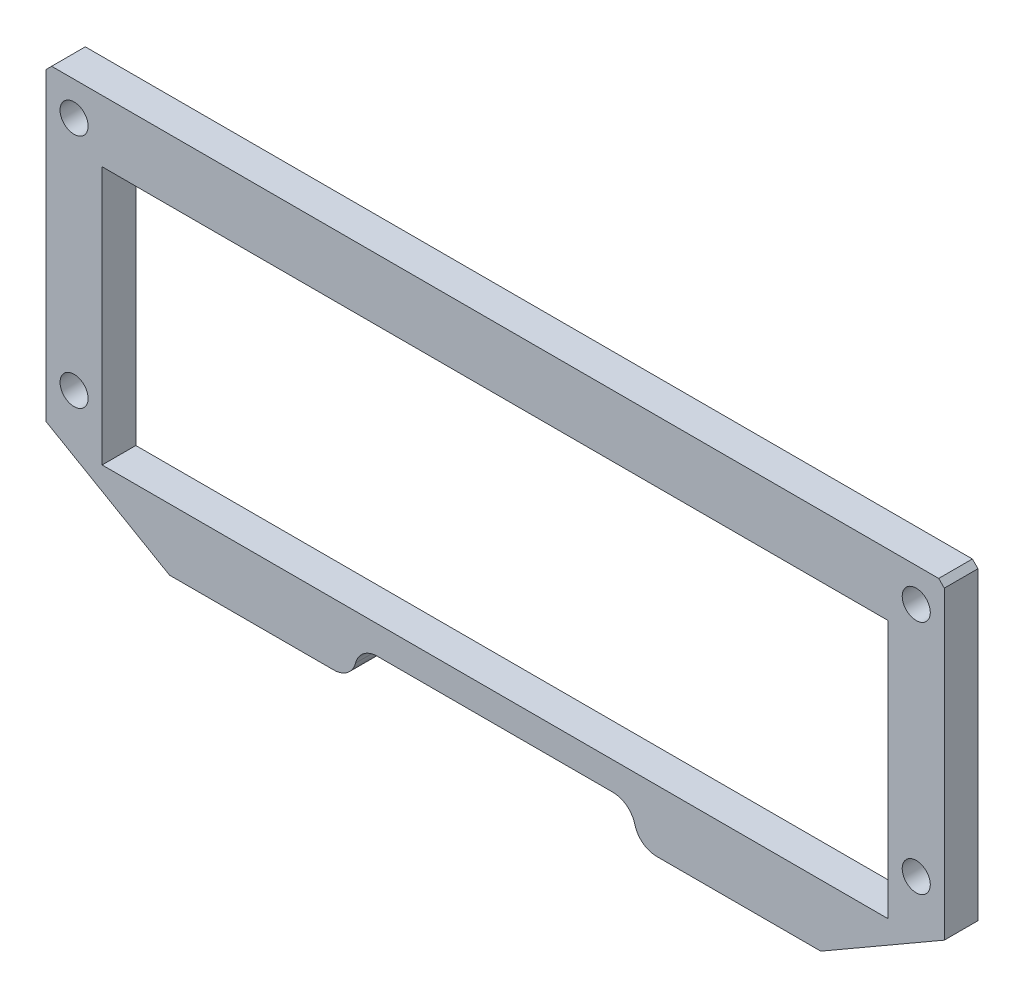
ISO-10303-21;
HEADER;
FILE_DESCRIPTION(('STEP AP214'),'2;1');
FILE_NAME('part.step','',(''),(''),'','','');
FILE_SCHEMA(('AUTOMOTIVE_DESIGN { 1 0 10303 214 1 1 1 1 }'));
ENDSEC;
DATA;
#1=APPLICATION_CONTEXT('core data for automotive mechanical design processes');
#2=APPLICATION_PROTOCOL_DEFINITION('international standard','automotive_design',2000,#1);
#3=PRODUCT_CONTEXT('',#1,'mechanical');
#4=PRODUCT('Part','Part','',(#3));
#5=PRODUCT_RELATED_PRODUCT_CATEGORY('part','',(#4));
#6=PRODUCT_DEFINITION_FORMATION('','',#4);
#7=PRODUCT_DEFINITION_CONTEXT('part definition',#1,'design');
#8=PRODUCT_DEFINITION('design','',#6,#7);
#9=PRODUCT_DEFINITION_SHAPE('','',#8);
#10=(LENGTH_UNIT() NAMED_UNIT(*) SI_UNIT(.MILLI.,.METRE.));
#11=(NAMED_UNIT(*) PLANE_ANGLE_UNIT() SI_UNIT($,.RADIAN.));
#12=(NAMED_UNIT(*) SI_UNIT($,.STERADIAN.) SOLID_ANGLE_UNIT());
#13=UNCERTAINTY_MEASURE_WITH_UNIT(LENGTH_MEASURE(1.E-05),#10,'distance_accuracy_value','');
#14=(GEOMETRIC_REPRESENTATION_CONTEXT(3) GLOBAL_UNCERTAINTY_ASSIGNED_CONTEXT((#13)) GLOBAL_UNIT_ASSIGNED_CONTEXT((#10,
#11,#12)) REPRESENTATION_CONTEXT('',''));
#15=CARTESIAN_POINT('',(0.,0.,0.));
#16=DIRECTION('',(0.,0.,1.));
#17=DIRECTION('',(1.,0.,0.));
#18=AXIS2_PLACEMENT_3D('',#15,#16,#17);
#19=CARTESIAN_POINT('',(-40.,-17.,3.));
#20=DIRECTION('',(0.,1.,0.));
#21=DIRECTION('',(0.,0.,1.));
#22=AXIS2_PLACEMENT_3D('',#19,#20,#21);
#23=PLANE('',#22);
#24=DIRECTION('',(1.,0.,0.));
#25=VECTOR('',#24,1.);
#26=CARTESIAN_POINT('',(-40.,-17.,0.));
#27=LINE('',#26,#25);
#28=CARTESIAN_POINT('',(-28.9999999999999,-17.,0.));
#29=VERTEX_POINT('',#28);
#30=CARTESIAN_POINT('',(-14.3729833462074,-17.,0.));
#31=VERTEX_POINT('',#30);
#32=EDGE_CURVE('E215',#29,#31,#27,.T.);
#33=ORIENTED_EDGE('',*,*,#32,.T.);
#34=DIRECTION('',(0.,0.,-1.));
#35=VECTOR('',#34,1.);
#36=CARTESIAN_POINT('',(-14.3729833462074,-17.,3.));
#37=LINE('',#36,#35);
#38=CARTESIAN_POINT('',(-14.3729833462074,-17.,3.));
#39=VERTEX_POINT('',#38);
#40=EDGE_CURVE('E42',#31,#39,#37,.F.);
#41=ORIENTED_EDGE('',*,*,#40,.T.);
#42=DIRECTION('',(1.,0.,0.));
#43=VECTOR('',#42,1.);
#44=CARTESIAN_POINT('',(-40.,-17.,3.));
#45=LINE('',#44,#43);
#46=CARTESIAN_POINT('',(-28.9999999999999,-17.,3.));
#47=VERTEX_POINT('',#46);
#48=EDGE_CURVE('E203',#47,#39,#45,.T.);
#49=ORIENTED_EDGE('',*,*,#48,.F.);
#50=DIRECTION('',(0.,0.,-1.));
#51=VECTOR('',#50,1.);
#52=CARTESIAN_POINT('',(-28.9999999999999,-17.,3.));
#53=LINE('',#52,#51);
#54=EDGE_CURVE('E265',#47,#29,#53,.T.);
#55=ORIENTED_EDGE('',*,*,#54,.T.);
#56=EDGE_LOOP('',(#33,#41,#49,#55));
#57=FACE_BOUND('',#56,.T.);
#58=ADVANCED_FACE('F34',(#57),#23,.F.);
#59=CARTESIAN_POINT('',(-40.,17.,3.));
#60=DIRECTION('',(1.,0.,0.));
#61=DIRECTION('',(0.,0.,-1.));
#62=AXIS2_PLACEMENT_3D('',#59,#60,#61);
#63=PLANE('',#62);
#64=DIRECTION('',(0.,-1.,0.));
#65=VECTOR('',#64,1.);
#66=CARTESIAN_POINT('',(-40.,17.,0.));
#67=LINE('',#66,#65);
#68=CARTESIAN_POINT('',(-40.,16.5,0.));
#69=VERTEX_POINT('',#68);
#70=CARTESIAN_POINT('',(-40.,-10.6491470389141,0.));
#71=VERTEX_POINT('',#70);
#72=EDGE_CURVE('E196',#69,#71,#67,.T.);
#73=ORIENTED_EDGE('',*,*,#72,.T.);
#74=DIRECTION('',(0.,0.,1.));
#75=VECTOR('',#74,1.);
#76=CARTESIAN_POINT('',(-40.,-10.6491470389141,3.));
#77=LINE('',#76,#75);
#78=CARTESIAN_POINT('',(-40.,-10.6491470389141,3.));
#79=VERTEX_POINT('',#78);
#80=EDGE_CURVE('E270',#71,#79,#77,.T.);
#81=ORIENTED_EDGE('',*,*,#80,.T.);
#82=DIRECTION('',(0.,-1.,0.));
#83=VECTOR('',#82,1.);
#84=CARTESIAN_POINT('',(-40.,17.,3.));
#85=LINE('',#84,#83);
#86=CARTESIAN_POINT('',(-40.,16.5,3.));
#87=VERTEX_POINT('',#86);
#88=EDGE_CURVE('E198',#87,#79,#85,.T.);
#89=ORIENTED_EDGE('',*,*,#88,.F.);
#90=DIRECTION('',(0.,0.,-1.));
#91=VECTOR('',#90,1.);
#92=CARTESIAN_POINT('',(-40.,16.5,3.));
#93=LINE('',#92,#91);
#94=EDGE_CURVE('E211',#87,#69,#93,.T.);
#95=ORIENTED_EDGE('',*,*,#94,.T.);
#96=EDGE_LOOP('',(#73,#81,#89,#95));
#97=FACE_BOUND('',#96,.T.);
#98=ADVANCED_FACE('F301',(#97),#63,.F.);
#99=CARTESIAN_POINT('',(14.3729833462074,-17.,3.));
#100=VERTEX_POINT('',#99);
#101=CARTESIAN_POINT('',(28.9999999999999,-17.,3.));
#102=VERTEX_POINT('',#101);
#103=EDGE_CURVE('E201',#100,#102,#45,.T.);
#104=ORIENTED_EDGE('',*,*,#103,.F.);
#105=DIRECTION('',(0.,0.,-1.));
#106=VECTOR('',#105,1.);
#107=CARTESIAN_POINT('',(14.3729833462074,-17.,3.));
#108=LINE('',#107,#106);
#109=CARTESIAN_POINT('',(14.3729833462074,-17.,0.));
#110=VERTEX_POINT('',#109);
#111=EDGE_CURVE('E281',#100,#110,#108,.T.);
#112=ORIENTED_EDGE('',*,*,#111,.T.);
#113=CARTESIAN_POINT('',(28.9999999999999,-17.,0.));
#114=VERTEX_POINT('',#113);
#115=EDGE_CURVE('E214',#110,#114,#27,.T.);
#116=ORIENTED_EDGE('',*,*,#115,.T.);
#117=DIRECTION('',(0.,0.,1.));
#118=VECTOR('',#117,1.);
#119=CARTESIAN_POINT('',(28.9999999999999,-17.,3.));
#120=LINE('',#119,#118);
#121=EDGE_CURVE('E260',#114,#102,#120,.T.);
#122=ORIENTED_EDGE('',*,*,#121,.T.);
#123=EDGE_LOOP('',(#104,#112,#116,#122));
#124=FACE_BOUND('',#123,.T.);
#125=ADVANCED_FACE('F327',(#124),#23,.F.);
#126=CARTESIAN_POINT('',(40.,17.,3.));
#127=DIRECTION('',(-1.,0.,0.));
#128=DIRECTION('',(0.,0.,1.));
#129=AXIS2_PLACEMENT_3D('',#126,#127,#128);
#130=PLANE('',#129);
#131=DIRECTION('',(0.,1.,0.));
#132=VECTOR('',#131,1.);
#133=CARTESIAN_POINT('',(40.,17.,3.));
#134=LINE('',#133,#132);
#135=CARTESIAN_POINT('',(40.,-10.6491470389141,3.));
#136=VERTEX_POINT('',#135);
#137=CARTESIAN_POINT('',(40.,16.5,3.));
#138=VERTEX_POINT('',#137);
#139=EDGE_CURVE('E206',#136,#138,#134,.T.);
#140=ORIENTED_EDGE('',*,*,#139,.F.);
#141=DIRECTION('',(0.,0.,-1.));
#142=VECTOR('',#141,1.);
#143=CARTESIAN_POINT('',(40.,-10.6491470389141,3.));
#144=LINE('',#143,#142);
#145=CARTESIAN_POINT('',(40.,-10.6491470389141,0.));
#146=VERTEX_POINT('',#145);
#147=EDGE_CURVE('E254',#136,#146,#144,.T.);
#148=ORIENTED_EDGE('',*,*,#147,.T.);
#149=DIRECTION('',(0.,1.,0.));
#150=VECTOR('',#149,1.);
#151=CARTESIAN_POINT('',(40.,17.,0.));
#152=LINE('',#151,#150);
#153=CARTESIAN_POINT('',(40.,16.5,0.));
#154=VERTEX_POINT('',#153);
#155=EDGE_CURVE('E217',#146,#154,#152,.T.);
#156=ORIENTED_EDGE('',*,*,#155,.T.);
#157=DIRECTION('',(0.,0.,1.));
#158=VECTOR('',#157,1.);
#159=CARTESIAN_POINT('',(40.,16.5,3.));
#160=LINE('',#159,#158);
#161=EDGE_CURVE('E237',#154,#138,#160,.T.);
#162=ORIENTED_EDGE('',*,*,#161,.T.);
#163=EDGE_LOOP('',(#140,#148,#156,#162));
#164=FACE_BOUND('',#163,.T.);
#165=ADVANCED_FACE('F320',(#164),#130,.F.);
#166=CARTESIAN_POINT('',(-40.,17.,3.));
#167=DIRECTION('',(0.,-1.,0.));
#168=DIRECTION('',(0.,0.,-1.));
#169=AXIS2_PLACEMENT_3D('',#166,#167,#168);
#170=PLANE('',#169);
#171=DIRECTION('',(-1.,0.,0.));
#172=VECTOR('',#171,1.);
#173=CARTESIAN_POINT('',(-40.,17.,0.));
#174=LINE('',#173,#172);
#175=CARTESIAN_POINT('',(39.5,17.,0.));
#176=VERTEX_POINT('',#175);
#177=CARTESIAN_POINT('',(-39.5,17.,0.));
#178=VERTEX_POINT('',#177);
#179=EDGE_CURVE('E202',#176,#178,#174,.T.);
#180=ORIENTED_EDGE('',*,*,#179,.T.);
#181=DIRECTION('',(0.,0.,1.));
#182=VECTOR('',#181,1.);
#183=CARTESIAN_POINT('',(-39.5,17.,3.));
#184=LINE('',#183,#182);
#185=CARTESIAN_POINT('',(-39.5,17.,3.));
#186=VERTEX_POINT('',#185);
#187=EDGE_CURVE('E231',#178,#186,#184,.T.);
#188=ORIENTED_EDGE('',*,*,#187,.T.);
#189=DIRECTION('',(-1.,0.,0.));
#190=VECTOR('',#189,1.);
#191=CARTESIAN_POINT('',(-40.,17.,3.));
#192=LINE('',#191,#190);
#193=CARTESIAN_POINT('',(39.5,17.,3.));
#194=VERTEX_POINT('',#193);
#195=EDGE_CURVE('E208',#194,#186,#192,.T.);
#196=ORIENTED_EDGE('',*,*,#195,.F.);
#197=DIRECTION('',(0.,0.,-1.));
#198=VECTOR('',#197,1.);
#199=CARTESIAN_POINT('',(39.5,17.,3.));
#200=LINE('',#199,#198);
#201=EDGE_CURVE('E228',#194,#176,#200,.T.);
#202=ORIENTED_EDGE('',*,*,#201,.T.);
#203=EDGE_LOOP('',(#180,#188,#196,#202));
#204=FACE_BOUND('',#203,.T.);
#205=ADVANCED_FACE('F309',(#204),#170,.F.);
#206=CARTESIAN_POINT('',(-40.,-17.,3.));
#207=DIRECTION('',(0.,0.,1.));
#208=DIRECTION('',(1.,0.,0.));
#209=AXIS2_PLACEMENT_3D('',#206,#207,#208);
#210=PLANE('',#209);
#211=CARTESIAN_POINT('',(-37.5,-7.,3.));
#212=DIRECTION('',(0.,0.,-1.));
#213=DIRECTION('',(-1.,0.,0.));
#214=AXIS2_PLACEMENT_3D('',#211,#212,#213);
#215=CIRCLE('',#214,1.25);
#216=CARTESIAN_POINT('',(-38.75,-7.,3.));
#217=VERTEX_POINT('',#216);
#218=EDGE_CURVE('E569',#217,#217,#215,.T.);
#219=ORIENTED_EDGE('',*,*,#218,.T.);
#220=EDGE_LOOP('',(#219));
#221=FACE_BOUND('',#220,.T.);
#222=CARTESIAN_POINT('',(-37.5,14.,3.));
#223=DIRECTION('',(0.,0.,-1.));
#224=DIRECTION('',(-1.,0.,0.));
#225=AXIS2_PLACEMENT_3D('',#222,#223,#224);
#226=CIRCLE('',#225,1.25);
#227=CARTESIAN_POINT('',(-38.75,14.,3.));
#228=VERTEX_POINT('',#227);
#229=EDGE_CURVE('E578',#228,#228,#226,.T.);
#230=ORIENTED_EDGE('',*,*,#229,.T.);
#231=EDGE_LOOP('',(#230));
#232=FACE_BOUND('',#231,.T.);
#233=CARTESIAN_POINT('',(37.5,14.,3.));
#234=DIRECTION('',(0.,0.,-1.));
#235=DIRECTION('',(-1.,0.,0.));
#236=AXIS2_PLACEMENT_3D('',#233,#234,#235);
#237=CIRCLE('',#236,1.25);
#238=CARTESIAN_POINT('',(36.25,14.,3.));
#239=VERTEX_POINT('',#238);
#240=EDGE_CURVE('E584',#239,#239,#237,.T.);
#241=ORIENTED_EDGE('',*,*,#240,.T.);
#242=EDGE_LOOP('',(#241));
#243=FACE_BOUND('',#242,.T.);
#244=CARTESIAN_POINT('',(37.5,-6.99999999999999,3.));
#245=DIRECTION('',(0.,0.,-1.));
#246=DIRECTION('',(-1.,0.,0.));
#247=AXIS2_PLACEMENT_3D('',#244,#245,#246);
#248=CIRCLE('',#247,1.25);
#249=CARTESIAN_POINT('',(36.25,-6.99999999999999,3.));
#250=VERTEX_POINT('',#249);
#251=EDGE_CURVE('E343',#250,#250,#248,.T.);
#252=ORIENTED_EDGE('',*,*,#251,.T.);
#253=EDGE_LOOP('',(#252));
#254=FACE_BOUND('',#253,.T.);
#255=CARTESIAN_POINT('',(10.5,-16.,3.));
#256=DIRECTION('',(0.,0.,1.));
#257=DIRECTION('',(1.,0.,0.));
#258=AXIS2_PLACEMENT_3D('',#255,#256,#257);
#259=CIRCLE('',#258,2.);
#260=CARTESIAN_POINT('',(10.5,-14.,3.));
#261=VERTEX_POINT('',#260);
#262=CARTESIAN_POINT('',(12.4364916731037,-15.5,3.));
#263=VERTEX_POINT('',#262);
#264=EDGE_CURVE('E245',#261,#263,#259,.F.);
#265=ORIENTED_EDGE('',*,*,#264,.T.);
#266=CARTESIAN_POINT('',(14.3729833462074,-15.,3.));
#267=DIRECTION('',(0.,0.,1.));
#268=DIRECTION('',(1.,0.,0.));
#269=AXIS2_PLACEMENT_3D('',#266,#267,#268);
#270=CIRCLE('',#269,2.);
#271=EDGE_CURVE('E279',#263,#100,#270,.T.);
#272=ORIENTED_EDGE('',*,*,#271,.T.);
#273=ORIENTED_EDGE('',*,*,#103,.T.);
#274=DIRECTION('',(-0.86602540378444,-0.499999999999998,0.));
#275=VECTOR('',#274,1.);
#276=CARTESIAN_POINT('',(-22.7500000000001,-46.877876430563,3.));
#277=LINE('',#276,#275);
#278=EDGE_CURVE('E263',#102,#136,#277,.F.);
#279=ORIENTED_EDGE('',*,*,#278,.T.);
#280=ORIENTED_EDGE('',*,*,#139,.T.);
#281=DIRECTION('',(0.707106781186552,-0.707106781186543,0.));
#282=VECTOR('',#281,1.);
#283=CARTESIAN_POINT('',(16.7499999999994,39.7500000000002,3.));
#284=LINE('',#283,#282);
#285=EDGE_CURVE('E233',#138,#194,#284,.F.);
#286=ORIENTED_EDGE('',*,*,#285,.T.);
#287=ORIENTED_EDGE('',*,*,#195,.T.);
#288=DIRECTION('',(0.707106781186557,0.707106781186538,0.));
#289=VECTOR('',#288,1.);
#290=CARTESIAN_POINT('',(-56.75,-0.249999999999535,3.));
#291=LINE('',#290,#289);
#292=EDGE_CURVE('E235',#186,#87,#291,.F.);
#293=ORIENTED_EDGE('',*,*,#292,.T.);
#294=ORIENTED_EDGE('',*,*,#88,.T.);
#295=DIRECTION('',(-0.86602540378444,0.499999999999998,0.));
#296=VECTOR('',#295,1.);
#297=CARTESIAN_POINT('',(-37.25,-12.2368602791856,3.));
#298=LINE('',#297,#296);
#299=EDGE_CURVE('E272',#79,#47,#298,.F.);
#300=ORIENTED_EDGE('',*,*,#299,.T.);
#301=ORIENTED_EDGE('',*,*,#48,.T.);
#302=CARTESIAN_POINT('',(-14.3729833462074,-15.,3.));
#303=DIRECTION('',(0.,0.,1.));
#304=DIRECTION('',(1.,0.,0.));
#305=AXIS2_PLACEMENT_3D('',#302,#303,#304);
#306=CIRCLE('',#305,2.);
#307=CARTESIAN_POINT('',(-12.4364916731037,-15.5,3.));
#308=VERTEX_POINT('',#307);
#309=EDGE_CURVE('E277',#39,#308,#306,.T.);
#310=ORIENTED_EDGE('',*,*,#309,.T.);
#311=CARTESIAN_POINT('',(-10.5,-16.,3.));
#312=DIRECTION('',(0.,0.,1.));
#313=DIRECTION('',(1.,0.,0.));
#314=AXIS2_PLACEMENT_3D('',#311,#312,#313);
#315=CIRCLE('',#314,2.);
#316=CARTESIAN_POINT('',(-10.5,-14.,3.));
#317=VERTEX_POINT('',#316);
#318=EDGE_CURVE('E250',#308,#317,#315,.F.);
#319=ORIENTED_EDGE('',*,*,#318,.T.);
#320=DIRECTION('',(-1.,0.,0.));
#321=VECTOR('',#320,1.);
#322=CARTESIAN_POINT('',(-12.5,-14.,3.));
#323=LINE('',#322,#321);
#324=EDGE_CURVE('E339',#261,#317,#323,.T.);
#325=ORIENTED_EDGE('',*,*,#324,.F.);
#326=EDGE_LOOP('',(#265,#272,#273,#279,#280,#286,#287,#293,#294,#300,#301,#310,#319,#325));
#327=FACE_BOUND('',#326,.T.);
#328=DIRECTION('',(0.,-1.,0.));
#329=VECTOR('',#328,1.);
#330=CARTESIAN_POINT('',(-35.,11.5,3.));
#331=LINE('',#330,#329);
#332=CARTESIAN_POINT('',(-35.,11.5,3.));
#333=VERTEX_POINT('',#332);
#334=CARTESIAN_POINT('',(-35.,-11.5,3.));
#335=VERTEX_POINT('',#334);
#336=EDGE_CURVE('E181',#333,#335,#331,.T.);
#337=ORIENTED_EDGE('',*,*,#336,.F.);
#338=DIRECTION('',(-1.,0.,0.));
#339=VECTOR('',#338,1.);
#340=CARTESIAN_POINT('',(-35.,11.5,3.));
#341=LINE('',#340,#339);
#342=CARTESIAN_POINT('',(35.,11.5,3.));
#343=VERTEX_POINT('',#342);
#344=EDGE_CURVE('E185',#343,#333,#341,.T.);
#345=ORIENTED_EDGE('',*,*,#344,.F.);
#346=DIRECTION('',(0.,1.,0.));
#347=VECTOR('',#346,1.);
#348=CARTESIAN_POINT('',(35.,11.5,3.));
#349=LINE('',#348,#347);
#350=CARTESIAN_POINT('',(35.,-11.5,3.));
#351=VERTEX_POINT('',#350);
#352=EDGE_CURVE('E165',#351,#343,#349,.T.);
#353=ORIENTED_EDGE('',*,*,#352,.F.);
#354=DIRECTION('',(1.,0.,0.));
#355=VECTOR('',#354,1.);
#356=CARTESIAN_POINT('',(-35.,-11.5,3.));
#357=LINE('',#356,#355);
#358=EDGE_CURVE('E176',#335,#351,#357,.T.);
#359=ORIENTED_EDGE('',*,*,#358,.F.);
#360=EDGE_LOOP('',(#337,#345,#353,#359));
#361=FACE_BOUND('',#360,.T.);
#362=ADVANCED_FACE('F183',(#221,#232,#243,#254,#327,#361),#210,.T.);
#363=CARTESIAN_POINT('',(-40.,-17.,0.));
#364=DIRECTION('',(0.,0.,1.));
#365=DIRECTION('',(1.,0.,0.));
#366=AXIS2_PLACEMENT_3D('',#363,#364,#365);
#367=PLANE('',#366);
#368=CARTESIAN_POINT('',(-37.5,-7.,0.));
#369=DIRECTION('',(0.,0.,-1.));
#370=DIRECTION('',(-1.,0.,0.));
#371=AXIS2_PLACEMENT_3D('',#368,#369,#370);
#372=CIRCLE('',#371,1.25);
#373=CARTESIAN_POINT('',(-38.75,-7.,0.));
#374=VERTEX_POINT('',#373);
#375=EDGE_CURVE('E571',#374,#374,#372,.T.);
#376=ORIENTED_EDGE('',*,*,#375,.F.);
#377=EDGE_LOOP('',(#376));
#378=FACE_BOUND('',#377,.T.);
#379=CARTESIAN_POINT('',(-37.5,14.,0.));
#380=DIRECTION('',(0.,0.,-1.));
#381=DIRECTION('',(-1.,0.,0.));
#382=AXIS2_PLACEMENT_3D('',#379,#380,#381);
#383=CIRCLE('',#382,1.25);
#384=CARTESIAN_POINT('',(-38.75,14.,0.));
#385=VERTEX_POINT('',#384);
#386=EDGE_CURVE('E573',#385,#385,#383,.T.);
#387=ORIENTED_EDGE('',*,*,#386,.F.);
#388=EDGE_LOOP('',(#387));
#389=FACE_BOUND('',#388,.T.);
#390=CARTESIAN_POINT('',(37.5,14.,0.));
#391=DIRECTION('',(0.,0.,-1.));
#392=DIRECTION('',(-1.,0.,0.));
#393=AXIS2_PLACEMENT_3D('',#390,#391,#392);
#394=CIRCLE('',#393,1.25);
#395=CARTESIAN_POINT('',(36.25,14.,0.));
#396=VERTEX_POINT('',#395);
#397=EDGE_CURVE('E581',#396,#396,#394,.T.);
#398=ORIENTED_EDGE('',*,*,#397,.F.);
#399=EDGE_LOOP('',(#398));
#400=FACE_BOUND('',#399,.T.);
#401=CARTESIAN_POINT('',(37.5,-6.99999999999999,0.));
#402=DIRECTION('',(0.,0.,-1.));
#403=DIRECTION('',(-1.,0.,0.));
#404=AXIS2_PLACEMENT_3D('',#401,#402,#403);
#405=CIRCLE('',#404,1.25);
#406=CARTESIAN_POINT('',(36.25,-6.99999999999999,0.));
#407=VERTEX_POINT('',#406);
#408=EDGE_CURVE('E348',#407,#407,#405,.T.);
#409=ORIENTED_EDGE('',*,*,#408,.F.);
#410=EDGE_LOOP('',(#409));
#411=FACE_BOUND('',#410,.T.);
#412=DIRECTION('',(1.,0.,0.));
#413=VECTOR('',#412,1.);
#414=CARTESIAN_POINT('',(-35.,11.5,0.));
#415=LINE('',#414,#413);
#416=CARTESIAN_POINT('',(-35.,11.5,0.));
#417=VERTEX_POINT('',#416);
#418=CARTESIAN_POINT('',(35.,11.5,0.));
#419=VERTEX_POINT('',#418);
#420=EDGE_CURVE('E352',#417,#419,#415,.T.);
#421=ORIENTED_EDGE('',*,*,#420,.F.);
#422=DIRECTION('',(0.,1.,0.));
#423=VECTOR('',#422,1.);
#424=CARTESIAN_POINT('',(-35.,11.5,0.));
#425=LINE('',#424,#423);
#426=CARTESIAN_POINT('',(-35.,-11.5,0.));
#427=VERTEX_POINT('',#426);
#428=EDGE_CURVE('E197',#427,#417,#425,.T.);
#429=ORIENTED_EDGE('',*,*,#428,.F.);
#430=DIRECTION('',(-1.,0.,0.));
#431=VECTOR('',#430,1.);
#432=CARTESIAN_POINT('',(-35.,-11.5,0.));
#433=LINE('',#432,#431);
#434=CARTESIAN_POINT('',(35.,-11.5,0.));
#435=VERTEX_POINT('',#434);
#436=EDGE_CURVE('E194',#435,#427,#433,.T.);
#437=ORIENTED_EDGE('',*,*,#436,.F.);
#438=DIRECTION('',(0.,-1.,0.));
#439=VECTOR('',#438,1.);
#440=CARTESIAN_POINT('',(35.,11.5,0.));
#441=LINE('',#440,#439);
#442=EDGE_CURVE('E168',#419,#435,#441,.T.);
#443=ORIENTED_EDGE('',*,*,#442,.F.);
#444=EDGE_LOOP('',(#421,#429,#437,#443));
#445=FACE_BOUND('',#444,.T.);
#446=ORIENTED_EDGE('',*,*,#115,.F.);
#447=CARTESIAN_POINT('',(14.3729833462074,-15.,0.));
#448=DIRECTION('',(0.,0.,1.));
#449=DIRECTION('',(1.,0.,0.));
#450=AXIS2_PLACEMENT_3D('',#447,#448,#449);
#451=CIRCLE('',#450,2.);
#452=CARTESIAN_POINT('',(12.4364916731037,-15.5,0.));
#453=VERTEX_POINT('',#452);
#454=EDGE_CURVE('E284',#110,#453,#451,.F.);
#455=ORIENTED_EDGE('',*,*,#454,.T.);
#456=CARTESIAN_POINT('',(10.5,-16.,0.));
#457=DIRECTION('',(0.,0.,1.));
#458=DIRECTION('',(1.,0.,0.));
#459=AXIS2_PLACEMENT_3D('',#456,#457,#458);
#460=CIRCLE('',#459,2.);
#461=CARTESIAN_POINT('',(10.5,-14.,0.));
#462=VERTEX_POINT('',#461);
#463=EDGE_CURVE('E248',#453,#462,#460,.T.);
#464=ORIENTED_EDGE('',*,*,#463,.T.);
#465=DIRECTION('',(1.,0.,0.));
#466=VECTOR('',#465,1.);
#467=CARTESIAN_POINT('',(-12.5,-14.,0.));
#468=LINE('',#467,#466);
#469=CARTESIAN_POINT('',(-10.5,-14.,0.));
#470=VERTEX_POINT('',#469);
#471=EDGE_CURVE('E342',#470,#462,#468,.T.);
#472=ORIENTED_EDGE('',*,*,#471,.F.);
#473=CARTESIAN_POINT('',(-10.5,-16.,0.));
#474=DIRECTION('',(0.,0.,1.));
#475=DIRECTION('',(1.,0.,0.));
#476=AXIS2_PLACEMENT_3D('',#473,#474,#475);
#477=CIRCLE('',#476,2.);
#478=CARTESIAN_POINT('',(-12.4364916731037,-15.5,0.));
#479=VERTEX_POINT('',#478);
#480=EDGE_CURVE('E252',#470,#479,#477,.T.);
#481=ORIENTED_EDGE('',*,*,#480,.T.);
#482=CARTESIAN_POINT('',(-14.3729833462074,-15.,0.));
#483=DIRECTION('',(0.,0.,1.));
#484=DIRECTION('',(1.,0.,0.));
#485=AXIS2_PLACEMENT_3D('',#482,#483,#484);
#486=CIRCLE('',#485,2.);
#487=EDGE_CURVE('E54',#479,#31,#486,.F.);
#488=ORIENTED_EDGE('',*,*,#487,.T.);
#489=ORIENTED_EDGE('',*,*,#32,.F.);
#490=DIRECTION('',(0.86602540378444,-0.499999999999998,0.));
#491=VECTOR('',#490,1.);
#492=CARTESIAN_POINT('',(-28.9999999999999,-17.,0.));
#493=LINE('',#492,#491);
#494=EDGE_CURVE('E268',#29,#71,#493,.F.);
#495=ORIENTED_EDGE('',*,*,#494,.T.);
#496=ORIENTED_EDGE('',*,*,#72,.F.);
#497=DIRECTION('',(-0.707106781186557,-0.707106781186538,0.));
#498=VECTOR('',#497,1.);
#499=CARTESIAN_POINT('',(-40.,16.5,0.));
#500=LINE('',#499,#498);
#501=EDGE_CURVE('E226',#69,#178,#500,.F.);
#502=ORIENTED_EDGE('',*,*,#501,.T.);
#503=ORIENTED_EDGE('',*,*,#179,.F.);
#504=DIRECTION('',(-0.707106781186552,0.707106781186543,0.));
#505=VECTOR('',#504,1.);
#506=CARTESIAN_POINT('',(39.5,17.,0.));
#507=LINE('',#506,#505);
#508=EDGE_CURVE('E223',#176,#154,#507,.F.);
#509=ORIENTED_EDGE('',*,*,#508,.T.);
#510=ORIENTED_EDGE('',*,*,#155,.F.);
#511=DIRECTION('',(0.86602540378444,0.499999999999998,0.));
#512=VECTOR('',#511,1.);
#513=CARTESIAN_POINT('',(40.,-10.6491470389141,0.));
#514=LINE('',#513,#512);
#515=EDGE_CURVE('E257',#146,#114,#514,.F.);
#516=ORIENTED_EDGE('',*,*,#515,.T.);
#517=EDGE_LOOP('',(#446,#455,#464,#472,#481,#488,#489,#495,#496,#502,#503,#509,#510,#516));
#518=FACE_BOUND('',#517,.T.);
#519=ADVANCED_FACE('F298',(#378,#389,#400,#411,#445,#518),#367,.F.);
#520=CARTESIAN_POINT('',(-35.,11.5,-73.6817480791546));
#521=DIRECTION('',(-1.,0.,0.));
#522=DIRECTION('',(0.,0.,1.));
#523=AXIS2_PLACEMENT_3D('',#520,#521,#522);
#524=PLANE('',#523);
#525=ORIENTED_EDGE('',*,*,#428,.T.);
#526=DIRECTION('',(0.,0.,1.));
#527=VECTOR('',#526,1.);
#528=CARTESIAN_POINT('',(-35.,11.5,-73.6817480791546));
#529=LINE('',#528,#527);
#530=EDGE_CURVE('E190',#417,#333,#529,.T.);
#531=ORIENTED_EDGE('',*,*,#530,.T.);
#532=ORIENTED_EDGE('',*,*,#336,.T.);
#533=DIRECTION('',(0.,0.,1.));
#534=VECTOR('',#533,1.);
#535=CARTESIAN_POINT('',(-35.,-11.5,-73.6817480791546));
#536=LINE('',#535,#534);
#537=EDGE_CURVE('E172',#427,#335,#536,.T.);
#538=ORIENTED_EDGE('',*,*,#537,.F.);
#539=EDGE_LOOP('',(#525,#531,#532,#538));
#540=FACE_BOUND('',#539,.T.);
#541=ADVANCED_FACE('F355',(#540),#524,.F.);
#542=CARTESIAN_POINT('',(-35.,11.5,-73.6817480791546));
#543=DIRECTION('',(0.,1.,0.));
#544=DIRECTION('',(0.,0.,1.));
#545=AXIS2_PLACEMENT_3D('',#542,#543,#544);
#546=PLANE('',#545);
#547=ORIENTED_EDGE('',*,*,#420,.T.);
#548=DIRECTION('',(0.,0.,1.));
#549=VECTOR('',#548,1.);
#550=CARTESIAN_POINT('',(35.,11.5,-73.6817480791546));
#551=LINE('',#550,#549);
#552=EDGE_CURVE('E171',#419,#343,#551,.T.);
#553=ORIENTED_EDGE('',*,*,#552,.T.);
#554=ORIENTED_EDGE('',*,*,#344,.T.);
#555=ORIENTED_EDGE('',*,*,#530,.F.);
#556=EDGE_LOOP('',(#547,#553,#554,#555));
#557=FACE_BOUND('',#556,.T.);
#558=ADVANCED_FACE('F360',(#557),#546,.F.);
#559=CARTESIAN_POINT('',(35.,11.5,-73.6817480791546));
#560=DIRECTION('',(1.,0.,0.));
#561=DIRECTION('',(0.,0.,-1.));
#562=AXIS2_PLACEMENT_3D('',#559,#560,#561);
#563=PLANE('',#562);
#564=ORIENTED_EDGE('',*,*,#442,.T.);
#565=DIRECTION('',(0.,0.,1.));
#566=VECTOR('',#565,1.);
#567=CARTESIAN_POINT('',(35.,-11.5,-73.6817480791546));
#568=LINE('',#567,#566);
#569=EDGE_CURVE('E160',#435,#351,#568,.T.);
#570=ORIENTED_EDGE('',*,*,#569,.T.);
#571=ORIENTED_EDGE('',*,*,#352,.T.);
#572=ORIENTED_EDGE('',*,*,#552,.F.);
#573=EDGE_LOOP('',(#564,#570,#571,#572));
#574=FACE_BOUND('',#573,.T.);
#575=ADVANCED_FACE('F162',(#574),#563,.F.);
#576=CARTESIAN_POINT('',(-35.,-11.5,-73.6817480791546));
#577=DIRECTION('',(0.,-1.,0.));
#578=DIRECTION('',(0.,0.,-1.));
#579=AXIS2_PLACEMENT_3D('',#576,#577,#578);
#580=PLANE('',#579);
#581=ORIENTED_EDGE('',*,*,#436,.T.);
#582=ORIENTED_EDGE('',*,*,#537,.T.);
#583=ORIENTED_EDGE('',*,*,#358,.T.);
#584=ORIENTED_EDGE('',*,*,#569,.F.);
#585=EDGE_LOOP('',(#581,#582,#583,#584));
#586=FACE_BOUND('',#585,.T.);
#587=ADVANCED_FACE('F177',(#586),#580,.F.);
#588=CARTESIAN_POINT('',(-40.,16.5,3.));
#589=DIRECTION('',(0.707106781186538,-0.707106781186557,0.));
#590=DIRECTION('',(0.707106781186557,0.707106781186538,0.));
#591=AXIS2_PLACEMENT_3D('',#588,#589,#590);
#592=PLANE('',#591);
#593=ORIENTED_EDGE('',*,*,#292,.F.);
#594=ORIENTED_EDGE('',*,*,#187,.F.);
#595=ORIENTED_EDGE('',*,*,#501,.F.);
#596=ORIENTED_EDGE('',*,*,#94,.F.);
#597=EDGE_LOOP('',(#593,#594,#595,#596));
#598=FACE_BOUND('',#597,.T.);
#599=ADVANCED_FACE('F305',(#598),#592,.F.);
#600=CARTESIAN_POINT('',(39.5,17.,3.));
#601=DIRECTION('',(-0.707106781186543,-0.707106781186552,0.));
#602=DIRECTION('',(0.707106781186552,-0.707106781186543,0.));
#603=AXIS2_PLACEMENT_3D('',#600,#601,#602);
#604=PLANE('',#603);
#605=ORIENTED_EDGE('',*,*,#285,.F.);
#606=ORIENTED_EDGE('',*,*,#161,.F.);
#607=ORIENTED_EDGE('',*,*,#508,.F.);
#608=ORIENTED_EDGE('',*,*,#201,.F.);
#609=EDGE_LOOP('',(#605,#606,#607,#608));
#610=FACE_BOUND('',#609,.T.);
#611=ADVANCED_FACE('F314',(#610),#604,.F.);
#612=CARTESIAN_POINT('',(-12.5,-14.,-25.1793566240283));
#613=DIRECTION('',(0.,1.,0.));
#614=DIRECTION('',(-1.,0.,0.));
#615=AXIS2_PLACEMENT_3D('',#612,#613,#614);
#616=PLANE('',#615);
#617=ORIENTED_EDGE('',*,*,#471,.T.);
#618=DIRECTION('',(0.,0.,1.));
#619=VECTOR('',#618,1.);
#620=CARTESIAN_POINT('',(10.5,-14.,3.));
#621=LINE('',#620,#619);
#622=EDGE_CURVE('E242',#462,#261,#621,.T.);
#623=ORIENTED_EDGE('',*,*,#622,.T.);
#624=ORIENTED_EDGE('',*,*,#324,.T.);
#625=DIRECTION('',(0.,0.,1.));
#626=VECTOR('',#625,1.);
#627=CARTESIAN_POINT('',(-10.5,-14.,0.));
#628=LINE('',#627,#626);
#629=EDGE_CURVE('E240',#317,#470,#628,.F.);
#630=ORIENTED_EDGE('',*,*,#629,.T.);
#631=EDGE_LOOP('',(#617,#623,#624,#630));
#632=FACE_BOUND('',#631,.T.);
#633=ADVANCED_FACE('F454',(#632),#616,.F.);
#634=CARTESIAN_POINT('',(10.5,-16.,-25.1793566240283));
#635=DIRECTION('',(0.,0.,-1.));
#636=DIRECTION('',(-1.,0.,0.));
#637=AXIS2_PLACEMENT_3D('',#634,#635,#636);
#638=CYLINDRICAL_SURFACE('',#637,2.);
#639=ORIENTED_EDGE('',*,*,#463,.F.);
#640=DIRECTION('',(0.,0.,-1.));
#641=VECTOR('',#640,1.);
#642=CARTESIAN_POINT('',(12.4364916731037,-15.5,-25.1793566240283));
#643=LINE('',#642,#641);
#644=EDGE_CURVE('E274',#453,#263,#643,.F.);
#645=ORIENTED_EDGE('',*,*,#644,.T.);
#646=ORIENTED_EDGE('',*,*,#264,.F.);
#647=ORIENTED_EDGE('',*,*,#622,.F.);
#648=EDGE_LOOP('',(#639,#645,#646,#647));
#649=FACE_BOUND('',#648,.T.);
#650=ADVANCED_FACE('F335',(#649),#638,.F.);
#651=CARTESIAN_POINT('',(-10.5,-16.,-25.1793566240283));
#652=DIRECTION('',(0.,0.,-1.));
#653=DIRECTION('',(-1.,0.,0.));
#654=AXIS2_PLACEMENT_3D('',#651,#652,#653);
#655=CYLINDRICAL_SURFACE('',#654,2.);
#656=ORIENTED_EDGE('',*,*,#318,.F.);
#657=DIRECTION('',(0.,0.,-1.));
#658=VECTOR('',#657,1.);
#659=CARTESIAN_POINT('',(-12.4364916731037,-15.5,-25.1793566240283));
#660=LINE('',#659,#658);
#661=EDGE_CURVE('E11',#308,#479,#660,.T.);
#662=ORIENTED_EDGE('',*,*,#661,.T.);
#663=ORIENTED_EDGE('',*,*,#480,.F.);
#664=ORIENTED_EDGE('',*,*,#629,.F.);
#665=EDGE_LOOP('',(#656,#662,#663,#664));
#666=FACE_BOUND('',#665,.T.);
#667=ADVANCED_FACE('F471',(#666),#655,.F.);
#668=CARTESIAN_POINT('',(40.,-10.6491470389141,3.));
#669=DIRECTION('',(-0.499999999999998,0.86602540378444,0.));
#670=DIRECTION('',(-0.86602540378444,-0.499999999999998,0.));
#671=AXIS2_PLACEMENT_3D('',#668,#669,#670);
#672=PLANE('',#671);
#673=ORIENTED_EDGE('',*,*,#278,.F.);
#674=ORIENTED_EDGE('',*,*,#121,.F.);
#675=ORIENTED_EDGE('',*,*,#515,.F.);
#676=ORIENTED_EDGE('',*,*,#147,.F.);
#677=EDGE_LOOP('',(#673,#674,#675,#676));
#678=FACE_BOUND('',#677,.T.);
#679=ADVANCED_FACE('F324',(#678),#672,.F.);
#680=CARTESIAN_POINT('',(-28.9999999999999,-17.,3.));
#681=DIRECTION('',(0.499999999999998,0.86602540378444,0.));
#682=DIRECTION('',(-0.86602540378444,0.499999999999998,0.));
#683=AXIS2_PLACEMENT_3D('',#680,#681,#682);
#684=PLANE('',#683);
#685=ORIENTED_EDGE('',*,*,#299,.F.);
#686=ORIENTED_EDGE('',*,*,#80,.F.);
#687=ORIENTED_EDGE('',*,*,#494,.F.);
#688=ORIENTED_EDGE('',*,*,#54,.F.);
#689=EDGE_LOOP('',(#685,#686,#687,#688));
#690=FACE_BOUND('',#689,.T.);
#691=ADVANCED_FACE('F296',(#690),#684,.F.);
#692=CARTESIAN_POINT('',(14.3729833462074,-15.,-25.1793566240283));
#693=DIRECTION('',(0.,0.,-1.));
#694=DIRECTION('',(-1.,0.,0.));
#695=AXIS2_PLACEMENT_3D('',#692,#693,#694);
#696=CYLINDRICAL_SURFACE('',#695,2.);
#697=ORIENTED_EDGE('',*,*,#454,.F.);
#698=ORIENTED_EDGE('',*,*,#111,.F.);
#699=ORIENTED_EDGE('',*,*,#271,.F.);
#700=ORIENTED_EDGE('',*,*,#644,.F.);
#701=EDGE_LOOP('',(#697,#698,#699,#700));
#702=FACE_BOUND('',#701,.T.);
#703=ADVANCED_FACE('F333',(#702),#696,.T.);
#704=CARTESIAN_POINT('',(-14.3729833462074,-15.,-25.1793566240283));
#705=DIRECTION('',(0.,0.,-1.));
#706=DIRECTION('',(-1.,0.,0.));
#707=AXIS2_PLACEMENT_3D('',#704,#705,#706);
#708=CYLINDRICAL_SURFACE('',#707,2.);
#709=ORIENTED_EDGE('',*,*,#487,.F.);
#710=ORIENTED_EDGE('',*,*,#661,.F.);
#711=ORIENTED_EDGE('',*,*,#309,.F.);
#712=ORIENTED_EDGE('',*,*,#40,.F.);
#713=EDGE_LOOP('',(#709,#710,#711,#712));
#714=FACE_BOUND('',#713,.T.);
#715=ADVANCED_FACE('F36',(#714),#708,.T.);
#716=CARTESIAN_POINT('',(37.5,-6.99999999999999,0.));
#717=DIRECTION('',(0.,0.,-1.));
#718=DIRECTION('',(-1.,0.,0.));
#719=AXIS2_PLACEMENT_3D('',#716,#717,#718);
#720=CYLINDRICAL_SURFACE('',#719,1.25);
#721=ORIENTED_EDGE('',*,*,#251,.F.);
#722=EDGE_LOOP('',(#721));
#723=FACE_BOUND('',#722,.T.);
#724=ORIENTED_EDGE('',*,*,#408,.T.);
#725=EDGE_LOOP('',(#724));
#726=FACE_BOUND('',#725,.T.);
#727=ADVANCED_FACE('F412',(#723,#726),#720,.F.);
#728=CARTESIAN_POINT('',(37.5,14.,0.));
#729=DIRECTION('',(0.,0.,-1.));
#730=DIRECTION('',(-1.,0.,0.));
#731=AXIS2_PLACEMENT_3D('',#728,#729,#730);
#732=CYLINDRICAL_SURFACE('',#731,1.25);
#733=ORIENTED_EDGE('',*,*,#240,.F.);
#734=EDGE_LOOP('',(#733));
#735=FACE_BOUND('',#734,.T.);
#736=ORIENTED_EDGE('',*,*,#397,.T.);
#737=EDGE_LOOP('',(#736));
#738=FACE_BOUND('',#737,.T.);
#739=ADVANCED_FACE('F417',(#735,#738),#732,.F.);
#740=CARTESIAN_POINT('',(-37.5,14.,0.));
#741=DIRECTION('',(0.,0.,-1.));
#742=DIRECTION('',(-1.,0.,0.));
#743=AXIS2_PLACEMENT_3D('',#740,#741,#742);
#744=CYLINDRICAL_SURFACE('',#743,1.25);
#745=ORIENTED_EDGE('',*,*,#229,.F.);
#746=EDGE_LOOP('',(#745));
#747=FACE_BOUND('',#746,.T.);
#748=ORIENTED_EDGE('',*,*,#386,.T.);
#749=EDGE_LOOP('',(#748));
#750=FACE_BOUND('',#749,.T.);
#751=ADVANCED_FACE('F427',(#747,#750),#744,.F.);
#752=CARTESIAN_POINT('',(-37.5,-7.,0.));
#753=DIRECTION('',(0.,0.,-1.));
#754=DIRECTION('',(-1.,0.,0.));
#755=AXIS2_PLACEMENT_3D('',#752,#753,#754);
#756=CYLINDRICAL_SURFACE('',#755,1.25);
#757=ORIENTED_EDGE('',*,*,#218,.F.);
#758=EDGE_LOOP('',(#757));
#759=FACE_BOUND('',#758,.T.);
#760=ORIENTED_EDGE('',*,*,#375,.T.);
#761=EDGE_LOOP('',(#760));
#762=FACE_BOUND('',#761,.T.);
#763=ADVANCED_FACE('F437',(#759,#762),#756,.F.);
#764=CLOSED_SHELL('',(#58,#98,#125,#165,#205,#362,#519,#541,#558,#575,#587,#599,#611,#633,#650,
#667,#679,#691,#703,#715,#727,#739,#751,#763));
#765=MANIFOLD_SOLID_BREP('B2',#764);
#766=ADVANCED_BREP_SHAPE_REPRESENTATION('',(#18,#765),#14);
#767=SHAPE_DEFINITION_REPRESENTATION(#9,#766);
ENDSEC;
END-ISO-10303-21;
